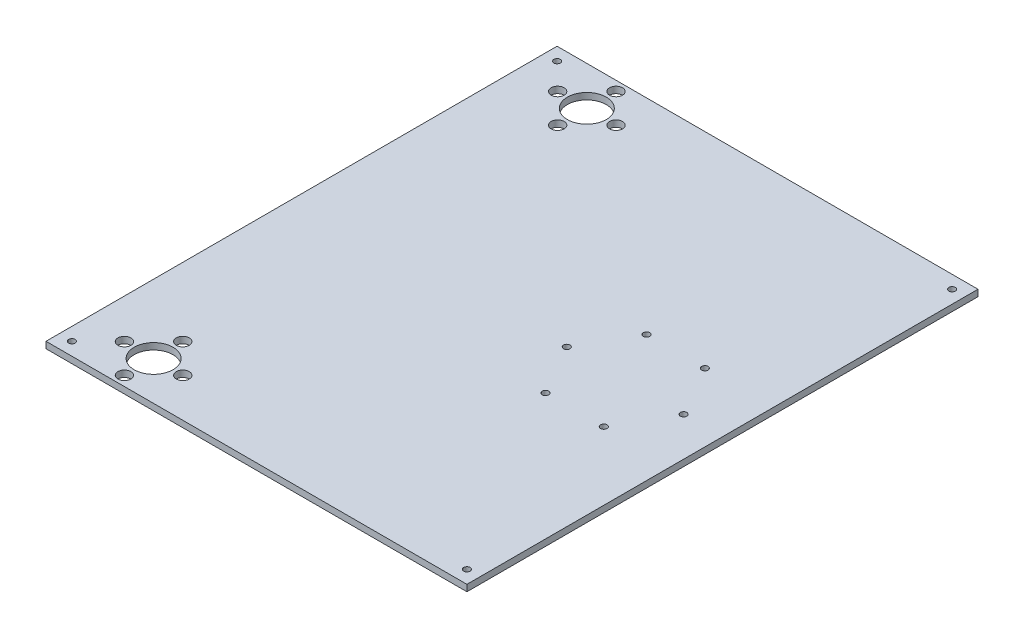
ISO-10303-21;
HEADER;
FILE_DESCRIPTION(('STEP AP214'),'2;1');
FILE_NAME('part.step','',(''),(''),'','','');
FILE_SCHEMA(('AUTOMOTIVE_DESIGN { 1 0 10303 214 1 1 1 1 }'));
ENDSEC;
DATA;
#1=APPLICATION_CONTEXT('core data for automotive mechanical design processes');
#2=APPLICATION_PROTOCOL_DEFINITION('international standard','automotive_design',2000,#1);
#3=PRODUCT_CONTEXT('',#1,'mechanical');
#4=PRODUCT('Part','Part','',(#3));
#5=PRODUCT_RELATED_PRODUCT_CATEGORY('part','',(#4));
#6=PRODUCT_DEFINITION_FORMATION('','',#4);
#7=PRODUCT_DEFINITION_CONTEXT('part definition',#1,'design');
#8=PRODUCT_DEFINITION('design','',#6,#7);
#9=PRODUCT_DEFINITION_SHAPE('','',#8);
#10=(LENGTH_UNIT() NAMED_UNIT(*) SI_UNIT(.MILLI.,.METRE.));
#11=(NAMED_UNIT(*) PLANE_ANGLE_UNIT() SI_UNIT($,.RADIAN.));
#12=(NAMED_UNIT(*) SI_UNIT($,.STERADIAN.) SOLID_ANGLE_UNIT());
#13=UNCERTAINTY_MEASURE_WITH_UNIT(LENGTH_MEASURE(1.E-05),#10,'distance_accuracy_value','');
#14=(GEOMETRIC_REPRESENTATION_CONTEXT(3) GLOBAL_UNCERTAINTY_ASSIGNED_CONTEXT((#13)) GLOBAL_UNIT_ASSIGNED_CONTEXT((#10,
#11,#12)) REPRESENTATION_CONTEXT('',''));
#15=CARTESIAN_POINT('',(0.,0.,0.));
#16=DIRECTION('',(0.,0.,1.));
#17=DIRECTION('',(1.,0.,0.));
#18=AXIS2_PLACEMENT_3D('',#15,#16,#17);
#19=CARTESIAN_POINT('',(162.25,5.,-197.));
#20=DIRECTION('',(-1.,0.,0.));
#21=DIRECTION('',(0.,0.,1.));
#22=AXIS2_PLACEMENT_3D('',#19,#20,#21);
#23=PLANE('',#22);
#24=DIRECTION('',(0.,0.,-1.));
#25=VECTOR('',#24,1.);
#26=CARTESIAN_POINT('',(162.25,0.,-197.));
#27=LINE('',#26,#25);
#28=CARTESIAN_POINT('',(162.25,0.,197.));
#29=VERTEX_POINT('',#28);
#30=CARTESIAN_POINT('',(162.25,0.,-197.));
#31=VERTEX_POINT('',#30);
#32=EDGE_CURVE('E97',#29,#31,#27,.T.);
#33=ORIENTED_EDGE('',*,*,#32,.T.);
#34=DIRECTION('',(0.,-1.,0.));
#35=VECTOR('',#34,1.);
#36=CARTESIAN_POINT('',(162.25,5.,-197.));
#37=LINE('',#36,#35);
#38=CARTESIAN_POINT('',(162.25,5.,-197.));
#39=VERTEX_POINT('',#38);
#40=EDGE_CURVE('E11',#39,#31,#37,.T.);
#41=ORIENTED_EDGE('',*,*,#40,.F.);
#42=DIRECTION('',(0.,0.,-1.));
#43=VECTOR('',#42,1.);
#44=CARTESIAN_POINT('',(162.25,5.,-197.));
#45=LINE('',#44,#43);
#46=CARTESIAN_POINT('',(162.25,5.,197.));
#47=VERTEX_POINT('',#46);
#48=EDGE_CURVE('E85',#47,#39,#45,.T.);
#49=ORIENTED_EDGE('',*,*,#48,.F.);
#50=DIRECTION('',(0.,-1.,0.));
#51=VECTOR('',#50,1.);
#52=CARTESIAN_POINT('',(162.25,5.,197.));
#53=LINE('',#52,#51);
#54=EDGE_CURVE('E93',#47,#29,#53,.T.);
#55=ORIENTED_EDGE('',*,*,#54,.T.);
#56=EDGE_LOOP('',(#33,#41,#49,#55));
#57=FACE_BOUND('',#56,.T.);
#58=ADVANCED_FACE('F34',(#57),#23,.F.);
#59=CARTESIAN_POINT('',(-162.25,5.,-197.));
#60=DIRECTION('',(0.,0.,1.));
#61=DIRECTION('',(1.,0.,0.));
#62=AXIS2_PLACEMENT_3D('',#59,#60,#61);
#63=PLANE('',#62);
#64=DIRECTION('',(-1.,0.,0.));
#65=VECTOR('',#64,1.);
#66=CARTESIAN_POINT('',(-162.25,0.,-197.));
#67=LINE('',#66,#65);
#68=CARTESIAN_POINT('',(-162.25,0.,-197.));
#69=VERTEX_POINT('',#68);
#70=EDGE_CURVE('E89',#31,#69,#67,.T.);
#71=ORIENTED_EDGE('',*,*,#70,.T.);
#72=DIRECTION('',(0.,-1.,0.));
#73=VECTOR('',#72,1.);
#74=CARTESIAN_POINT('',(-162.25,5.,-197.));
#75=LINE('',#74,#73);
#76=CARTESIAN_POINT('',(-162.25,5.,-197.));
#77=VERTEX_POINT('',#76);
#78=EDGE_CURVE('E42',#77,#69,#75,.T.);
#79=ORIENTED_EDGE('',*,*,#78,.F.);
#80=DIRECTION('',(-1.,0.,0.));
#81=VECTOR('',#80,1.);
#82=CARTESIAN_POINT('',(-162.25,5.,-197.));
#83=LINE('',#82,#81);
#84=EDGE_CURVE('E80',#39,#77,#83,.T.);
#85=ORIENTED_EDGE('',*,*,#84,.F.);
#86=ORIENTED_EDGE('',*,*,#40,.T.);
#87=EDGE_LOOP('',(#71,#79,#85,#86));
#88=FACE_BOUND('',#87,.T.);
#89=ADVANCED_FACE('F88',(#88),#63,.F.);
#90=CARTESIAN_POINT('',(-162.25,5.,-197.));
#91=DIRECTION('',(1.,0.,0.));
#92=DIRECTION('',(0.,0.,-1.));
#93=AXIS2_PLACEMENT_3D('',#90,#91,#92);
#94=PLANE('',#93);
#95=DIRECTION('',(0.,0.,1.));
#96=VECTOR('',#95,1.);
#97=CARTESIAN_POINT('',(-162.25,0.,-197.));
#98=LINE('',#97,#96);
#99=CARTESIAN_POINT('',(-162.25,0.,197.));
#100=VERTEX_POINT('',#99);
#101=EDGE_CURVE('E67',#69,#100,#98,.T.);
#102=ORIENTED_EDGE('',*,*,#101,.T.);
#103=DIRECTION('',(0.,-1.,0.));
#104=VECTOR('',#103,1.);
#105=CARTESIAN_POINT('',(-162.25,5.,197.));
#106=LINE('',#105,#104);
#107=CARTESIAN_POINT('',(-162.25,5.,197.));
#108=VERTEX_POINT('',#107);
#109=EDGE_CURVE('E90',#108,#100,#106,.T.);
#110=ORIENTED_EDGE('',*,*,#109,.F.);
#111=DIRECTION('',(0.,0.,1.));
#112=VECTOR('',#111,1.);
#113=CARTESIAN_POINT('',(-162.25,5.,-197.));
#114=LINE('',#113,#112);
#115=EDGE_CURVE('E83',#77,#108,#114,.T.);
#116=ORIENTED_EDGE('',*,*,#115,.F.);
#117=ORIENTED_EDGE('',*,*,#78,.T.);
#118=EDGE_LOOP('',(#102,#110,#116,#117));
#119=FACE_BOUND('',#118,.T.);
#120=ADVANCED_FACE('F91',(#119),#94,.F.);
#121=CARTESIAN_POINT('',(-162.25,5.,197.));
#122=DIRECTION('',(0.,0.,-1.));
#123=DIRECTION('',(-1.,0.,0.));
#124=AXIS2_PLACEMENT_3D('',#121,#122,#123);
#125=PLANE('',#124);
#126=DIRECTION('',(1.,0.,0.));
#127=VECTOR('',#126,1.);
#128=CARTESIAN_POINT('',(-162.25,0.,197.));
#129=LINE('',#128,#127);
#130=EDGE_CURVE('E73',#100,#29,#129,.T.);
#131=ORIENTED_EDGE('',*,*,#130,.T.);
#132=ORIENTED_EDGE('',*,*,#54,.F.);
#133=DIRECTION('',(1.,0.,0.));
#134=VECTOR('',#133,1.);
#135=CARTESIAN_POINT('',(-162.25,5.,197.));
#136=LINE('',#135,#134);
#137=EDGE_CURVE('E50',#108,#47,#136,.T.);
#138=ORIENTED_EDGE('',*,*,#137,.F.);
#139=ORIENTED_EDGE('',*,*,#109,.T.);
#140=EDGE_LOOP('',(#131,#132,#138,#139));
#141=FACE_BOUND('',#140,.T.);
#142=ADVANCED_FACE('F105',(#141),#125,.F.);
#143=CARTESIAN_POINT('',(0.,5.,0.));
#144=DIRECTION('',(0.,1.,0.));
#145=DIRECTION('',(0.,0.,1.));
#146=AXIS2_PLACEMENT_3D('',#143,#144,#145);
#147=PLANE('',#146);
#148=CARTESIAN_POINT('',(-109.309999999999,5.,-144.5));
#149=DIRECTION('',(0.,1.,0.));
#150=DIRECTION('',(0.,0.,1.));
#151=AXIS2_PLACEMENT_3D('',#148,#149,#150);
#152=CIRCLE('',#151,5.);
#153=CARTESIAN_POINT('',(-109.309999999999,5.,-139.5));
#154=VERTEX_POINT('',#153);
#155=EDGE_CURVE('E201',#154,#154,#152,.T.);
#156=ORIENTED_EDGE('',*,*,#155,.F.);
#157=EDGE_LOOP('',(#156));
#158=FACE_BOUND('',#157,.T.);
#159=CARTESIAN_POINT('',(-86.8099999999997,5.,-167.));
#160=DIRECTION('',(0.,1.,0.));
#161=DIRECTION('',(0.,0.,1.));
#162=AXIS2_PLACEMENT_3D('',#159,#160,#161);
#163=CIRCLE('',#162,4.99999999999998);
#164=CARTESIAN_POINT('',(-86.8099999999997,5.,-162.));
#165=VERTEX_POINT('',#164);
#166=EDGE_CURVE('E208',#165,#165,#163,.T.);
#167=ORIENTED_EDGE('',*,*,#166,.F.);
#168=EDGE_LOOP('',(#167));
#169=FACE_BOUND('',#168,.T.);
#170=CARTESIAN_POINT('',(-86.81,5.,167.));
#171=DIRECTION('',(0.,1.,0.));
#172=DIRECTION('',(0.,0.,1.));
#173=AXIS2_PLACEMENT_3D('',#170,#171,#172);
#174=CIRCLE('',#173,5.);
#175=CARTESIAN_POINT('',(-86.81,5.,172.));
#176=VERTEX_POINT('',#175);
#177=EDGE_CURVE('E214',#176,#176,#174,.T.);
#178=ORIENTED_EDGE('',*,*,#177,.F.);
#179=EDGE_LOOP('',(#178));
#180=FACE_BOUND('',#179,.T.);
#181=CARTESIAN_POINT('',(-109.31,5.,144.5));
#182=DIRECTION('',(0.,1.,0.));
#183=DIRECTION('',(0.,0.,1.));
#184=AXIS2_PLACEMENT_3D('',#181,#182,#183);
#185=CIRCLE('',#184,4.99999999999999);
#186=CARTESIAN_POINT('',(-109.31,5.,149.5));
#187=VERTEX_POINT('',#186);
#188=EDGE_CURVE('E220',#187,#187,#185,.T.);
#189=ORIENTED_EDGE('',*,*,#188,.F.);
#190=EDGE_LOOP('',(#189));
#191=FACE_BOUND('',#190,.T.);
#192=CARTESIAN_POINT('',(-109.31,5.,167.));
#193=DIRECTION('',(0.,1.,0.));
#194=DIRECTION('',(0.,0.,1.));
#195=AXIS2_PLACEMENT_3D('',#192,#193,#194);
#196=CIRCLE('',#195,15.);
#197=CARTESIAN_POINT('',(-109.31,5.,182.));
#198=VERTEX_POINT('',#197);
#199=EDGE_CURVE('E184',#198,#198,#196,.T.);
#200=ORIENTED_EDGE('',*,*,#199,.F.);
#201=EDGE_LOOP('',(#200));
#202=FACE_BOUND('',#201,.T.);
#203=CARTESIAN_POINT('',(-109.31,5.,-189.5));
#204=DIRECTION('',(0.,1.,0.));
#205=DIRECTION('',(0.,0.,1.));
#206=AXIS2_PLACEMENT_3D('',#203,#204,#205);
#207=CIRCLE('',#206,5.00000000000001);
#208=CARTESIAN_POINT('',(-109.31,5.,-184.5));
#209=VERTEX_POINT('',#208);
#210=EDGE_CURVE('E177',#209,#209,#207,.T.);
#211=ORIENTED_EDGE('',*,*,#210,.F.);
#212=EDGE_LOOP('',(#211));
#213=FACE_BOUND('',#212,.T.);
#214=CARTESIAN_POINT('',(-109.31,5.,189.5));
#215=DIRECTION('',(0.,1.,0.));
#216=DIRECTION('',(0.,0.,1.));
#217=AXIS2_PLACEMENT_3D('',#214,#215,#216);
#218=CIRCLE('',#217,5.00000000000001);
#219=CARTESIAN_POINT('',(-109.31,5.,194.5));
#220=VERTEX_POINT('',#219);
#221=EDGE_CURVE('E196',#220,#220,#218,.T.);
#222=ORIENTED_EDGE('',*,*,#221,.F.);
#223=EDGE_LOOP('',(#222));
#224=FACE_BOUND('',#223,.T.);
#225=CARTESIAN_POINT('',(-131.81,5.,167.));
#226=DIRECTION('',(0.,1.,0.));
#227=DIRECTION('',(0.,0.,1.));
#228=AXIS2_PLACEMENT_3D('',#225,#226,#227);
#229=CIRCLE('',#228,5.00000000000001);
#230=CARTESIAN_POINT('',(-131.81,5.,172.));
#231=VERTEX_POINT('',#230);
#232=EDGE_CURVE('E189',#231,#231,#229,.T.);
#233=ORIENTED_EDGE('',*,*,#232,.F.);
#234=EDGE_LOOP('',(#233));
#235=FACE_BOUND('',#234,.T.);
#236=CARTESIAN_POINT('',(-131.81,5.,-167.));
#237=DIRECTION('',(0.,1.,0.));
#238=DIRECTION('',(0.,0.,1.));
#239=AXIS2_PLACEMENT_3D('',#236,#237,#238);
#240=CIRCLE('',#239,5.00000000000003);
#241=CARTESIAN_POINT('',(-131.81,5.,-162.));
#242=VERTEX_POINT('',#241);
#243=EDGE_CURVE('E225',#242,#242,#240,.T.);
#244=ORIENTED_EDGE('',*,*,#243,.F.);
#245=EDGE_LOOP('',(#244));
#246=FACE_BOUND('',#245,.T.);
#247=CARTESIAN_POINT('',(-109.31,5.,-167.));
#248=DIRECTION('',(0.,1.,0.));
#249=DIRECTION('',(0.,0.,1.));
#250=AXIS2_PLACEMENT_3D('',#247,#248,#249);
#251=CIRCLE('',#250,15.);
#252=CARTESIAN_POINT('',(-109.31,5.,-152.));
#253=VERTEX_POINT('',#252);
#254=EDGE_CURVE('E171',#253,#253,#251,.T.);
#255=ORIENTED_EDGE('',*,*,#254,.F.);
#256=EDGE_LOOP('',(#255));
#257=FACE_BOUND('',#256,.T.);
#258=CARTESIAN_POINT('',(132.25,5.,0.));
#259=DIRECTION('',(0.,1.,0.));
#260=DIRECTION('',(0.,0.,1.));
#261=AXIS2_PLACEMENT_3D('',#258,#259,#260);
#262=CIRCLE('',#261,2.5);
#263=CARTESIAN_POINT('',(132.25,5.,2.5));
#264=VERTEX_POINT('',#263);
#265=EDGE_CURVE('E160',#264,#264,#262,.T.);
#266=ORIENTED_EDGE('',*,*,#265,.F.);
#267=EDGE_LOOP('',(#266));
#268=FACE_BOUND('',#267,.T.);
#269=CARTESIAN_POINT('',(109.749999999999,5.,-38.9711431702988));
#270=DIRECTION('',(0.,1.,0.));
#271=DIRECTION('',(0.,0.,1.));
#272=AXIS2_PLACEMENT_3D('',#269,#270,#271);
#273=CIRCLE('',#272,2.49999999999999);
#274=CARTESIAN_POINT('',(109.749999999999,5.,-36.4711431702989));
#275=VERTEX_POINT('',#274);
#276=EDGE_CURVE('E161',#275,#275,#273,.T.);
#277=ORIENTED_EDGE('',*,*,#276,.F.);
#278=EDGE_LOOP('',(#277));
#279=FACE_BOUND('',#278,.T.);
#280=CARTESIAN_POINT('',(64.7499999999994,5.,-38.971143170298));
#281=DIRECTION('',(0.,1.,0.));
#282=DIRECTION('',(0.,0.,1.));
#283=AXIS2_PLACEMENT_3D('',#280,#281,#282);
#284=CIRCLE('',#283,2.49999999999999);
#285=CARTESIAN_POINT('',(64.7499999999994,5.,-36.471143170298));
#286=VERTEX_POINT('',#285);
#287=EDGE_CURVE('E135',#286,#286,#284,.T.);
#288=ORIENTED_EDGE('',*,*,#287,.F.);
#289=EDGE_LOOP('',(#288));
#290=FACE_BOUND('',#289,.T.);
#291=CARTESIAN_POINT('',(42.2500000000001,5.,2.19273067816165E-12));
#292=DIRECTION('',(0.,1.,0.));
#293=DIRECTION('',(0.,0.,1.));
#294=AXIS2_PLACEMENT_3D('',#291,#292,#293);
#295=CIRCLE('',#294,2.49999999999999);
#296=CARTESIAN_POINT('',(42.2500000000001,5.,2.50000000000218));
#297=VERTEX_POINT('',#296);
#298=EDGE_CURVE('E142',#297,#297,#295,.T.);
#299=ORIENTED_EDGE('',*,*,#298,.F.);
#300=EDGE_LOOP('',(#299));
#301=FACE_BOUND('',#300,.T.);
#302=CARTESIAN_POINT('',(64.7500000000009,5.,38.9711431703015));
#303=DIRECTION('',(0.,1.,0.));
#304=DIRECTION('',(0.,0.,1.));
#305=AXIS2_PLACEMENT_3D('',#302,#303,#304);
#306=CIRCLE('',#305,2.49999999999999);
#307=CARTESIAN_POINT('',(64.7500000000009,5.,41.4711431703015));
#308=VERTEX_POINT('',#307);
#309=EDGE_CURVE('E148',#308,#308,#306,.T.);
#310=ORIENTED_EDGE('',*,*,#309,.F.);
#311=EDGE_LOOP('',(#310));
#312=FACE_BOUND('',#311,.T.);
#313=CARTESIAN_POINT('',(109.750000000001,5.,38.9711431703004));
#314=DIRECTION('',(0.,1.,0.));
#315=DIRECTION('',(0.,0.,1.));
#316=AXIS2_PLACEMENT_3D('',#313,#314,#315);
#317=CIRCLE('',#316,2.5);
#318=CARTESIAN_POINT('',(109.750000000001,5.,41.4711431703004));
#319=VERTEX_POINT('',#318);
#320=EDGE_CURVE('E154',#319,#319,#317,.T.);
#321=ORIENTED_EDGE('',*,*,#320,.F.);
#322=EDGE_LOOP('',(#321));
#323=FACE_BOUND('',#322,.T.);
#324=CARTESIAN_POINT('',(152.25,5.,187.));
#325=DIRECTION('',(0.,1.,0.));
#326=DIRECTION('',(0.,0.,1.));
#327=AXIS2_PLACEMENT_3D('',#324,#325,#326);
#328=CIRCLE('',#327,2.5);
#329=CARTESIAN_POINT('',(152.25,5.,189.5));
#330=VERTEX_POINT('',#329);
#331=EDGE_CURVE('E117',#330,#330,#328,.T.);
#332=ORIENTED_EDGE('',*,*,#331,.F.);
#333=EDGE_LOOP('',(#332));
#334=FACE_BOUND('',#333,.T.);
#335=CARTESIAN_POINT('',(-152.25,5.,187.));
#336=DIRECTION('',(0.,1.,0.));
#337=DIRECTION('',(0.,0.,1.));
#338=AXIS2_PLACEMENT_3D('',#335,#336,#337);
#339=CIRCLE('',#338,2.5);
#340=CARTESIAN_POINT('',(-152.25,5.,189.5));
#341=VERTEX_POINT('',#340);
#342=EDGE_CURVE('E124',#341,#341,#339,.T.);
#343=ORIENTED_EDGE('',*,*,#342,.F.);
#344=EDGE_LOOP('',(#343));
#345=FACE_BOUND('',#344,.T.);
#346=CARTESIAN_POINT('',(-152.25,5.,-187.));
#347=DIRECTION('',(0.,1.,0.));
#348=DIRECTION('',(0.,0.,1.));
#349=AXIS2_PLACEMENT_3D('',#346,#347,#348);
#350=CIRCLE('',#349,2.5);
#351=CARTESIAN_POINT('',(-152.25,5.,-184.5));
#352=VERTEX_POINT('',#351);
#353=EDGE_CURVE('E130',#352,#352,#350,.T.);
#354=ORIENTED_EDGE('',*,*,#353,.F.);
#355=EDGE_LOOP('',(#354));
#356=FACE_BOUND('',#355,.T.);
#357=CARTESIAN_POINT('',(152.25,5.,-187.));
#358=DIRECTION('',(0.,1.,0.));
#359=DIRECTION('',(0.,0.,1.));
#360=AXIS2_PLACEMENT_3D('',#357,#358,#359);
#361=CIRCLE('',#360,2.5);
#362=CARTESIAN_POINT('',(152.25,5.,-184.5));
#363=VERTEX_POINT('',#362);
#364=EDGE_CURVE('E111',#363,#363,#361,.T.);
#365=ORIENTED_EDGE('',*,*,#364,.F.);
#366=EDGE_LOOP('',(#365));
#367=FACE_BOUND('',#366,.T.);
#368=ORIENTED_EDGE('',*,*,#48,.T.);
#369=ORIENTED_EDGE('',*,*,#84,.T.);
#370=ORIENTED_EDGE('',*,*,#115,.T.);
#371=ORIENTED_EDGE('',*,*,#137,.T.);
#372=EDGE_LOOP('',(#368,#369,#370,#371));
#373=FACE_BOUND('',#372,.T.);
#374=ADVANCED_FACE('F81',(#158,#169,#180,#191,#202,#213,#224,#235,#246,#257,#268,#279,#290,#301,
#312,#323,#334,#345,#356,#367,#373),#147,.T.);
#375=CARTESIAN_POINT('',(0.,0.,0.));
#376=DIRECTION('',(0.,1.,0.));
#377=DIRECTION('',(0.,0.,1.));
#378=AXIS2_PLACEMENT_3D('',#375,#376,#377);
#379=PLANE('',#378);
#380=CARTESIAN_POINT('',(-109.309999999999,0.,-144.5));
#381=DIRECTION('',(0.,1.,0.));
#382=DIRECTION('',(0.,0.,1.));
#383=AXIS2_PLACEMENT_3D('',#380,#381,#382);
#384=CIRCLE('',#383,5.);
#385=CARTESIAN_POINT('',(-109.309999999999,0.,-139.5));
#386=VERTEX_POINT('',#385);
#387=EDGE_CURVE('E204',#386,#386,#384,.T.);
#388=ORIENTED_EDGE('',*,*,#387,.T.);
#389=EDGE_LOOP('',(#388));
#390=FACE_BOUND('',#389,.T.);
#391=CARTESIAN_POINT('',(-86.8099999999997,0.,-167.));
#392=DIRECTION('',(0.,1.,0.));
#393=DIRECTION('',(0.,0.,1.));
#394=AXIS2_PLACEMENT_3D('',#391,#392,#393);
#395=CIRCLE('',#394,4.99999999999998);
#396=CARTESIAN_POINT('',(-86.8099999999997,0.,-162.));
#397=VERTEX_POINT('',#396);
#398=EDGE_CURVE('E211',#397,#397,#395,.T.);
#399=ORIENTED_EDGE('',*,*,#398,.T.);
#400=EDGE_LOOP('',(#399));
#401=FACE_BOUND('',#400,.T.);
#402=CARTESIAN_POINT('',(-86.81,0.,167.));
#403=DIRECTION('',(0.,1.,0.));
#404=DIRECTION('',(0.,0.,1.));
#405=AXIS2_PLACEMENT_3D('',#402,#403,#404);
#406=CIRCLE('',#405,5.);
#407=CARTESIAN_POINT('',(-86.81,0.,172.));
#408=VERTEX_POINT('',#407);
#409=EDGE_CURVE('E217',#408,#408,#406,.T.);
#410=ORIENTED_EDGE('',*,*,#409,.T.);
#411=EDGE_LOOP('',(#410));
#412=FACE_BOUND('',#411,.T.);
#413=CARTESIAN_POINT('',(-109.31,0.,144.5));
#414=DIRECTION('',(0.,1.,0.));
#415=DIRECTION('',(0.,0.,1.));
#416=AXIS2_PLACEMENT_3D('',#413,#414,#415);
#417=CIRCLE('',#416,4.99999999999999);
#418=CARTESIAN_POINT('',(-109.31,0.,149.5));
#419=VERTEX_POINT('',#418);
#420=EDGE_CURVE('E193',#419,#419,#417,.T.);
#421=ORIENTED_EDGE('',*,*,#420,.T.);
#422=EDGE_LOOP('',(#421));
#423=FACE_BOUND('',#422,.T.);
#424=CARTESIAN_POINT('',(-109.31,0.,167.));
#425=DIRECTION('',(0.,1.,0.));
#426=DIRECTION('',(0.,0.,1.));
#427=AXIS2_PLACEMENT_3D('',#424,#425,#426);
#428=CIRCLE('',#427,15.);
#429=CARTESIAN_POINT('',(-109.31,0.,182.));
#430=VERTEX_POINT('',#429);
#431=EDGE_CURVE('E174',#430,#430,#428,.T.);
#432=ORIENTED_EDGE('',*,*,#431,.T.);
#433=EDGE_LOOP('',(#432));
#434=FACE_BOUND('',#433,.T.);
#435=CARTESIAN_POINT('',(-109.31,0.,-189.5));
#436=DIRECTION('',(0.,1.,0.));
#437=DIRECTION('',(0.,0.,1.));
#438=AXIS2_PLACEMENT_3D('',#435,#436,#437);
#439=CIRCLE('',#438,5.00000000000001);
#440=CARTESIAN_POINT('',(-109.31,0.,-184.5));
#441=VERTEX_POINT('',#440);
#442=EDGE_CURVE('E180',#441,#441,#439,.T.);
#443=ORIENTED_EDGE('',*,*,#442,.T.);
#444=EDGE_LOOP('',(#443));
#445=FACE_BOUND('',#444,.T.);
#446=CARTESIAN_POINT('',(-109.31,0.,189.5));
#447=DIRECTION('',(0.,1.,0.));
#448=DIRECTION('',(0.,0.,1.));
#449=AXIS2_PLACEMENT_3D('',#446,#447,#448);
#450=CIRCLE('',#449,5.00000000000001);
#451=CARTESIAN_POINT('',(-109.31,0.,194.5));
#452=VERTEX_POINT('',#451);
#453=EDGE_CURVE('E181',#452,#452,#450,.T.);
#454=ORIENTED_EDGE('',*,*,#453,.T.);
#455=EDGE_LOOP('',(#454));
#456=FACE_BOUND('',#455,.T.);
#457=CARTESIAN_POINT('',(-131.81,0.,167.));
#458=DIRECTION('',(0.,1.,0.));
#459=DIRECTION('',(0.,0.,1.));
#460=AXIS2_PLACEMENT_3D('',#457,#458,#459);
#461=CIRCLE('',#460,5.00000000000001);
#462=CARTESIAN_POINT('',(-131.81,0.,172.));
#463=VERTEX_POINT('',#462);
#464=EDGE_CURVE('E192',#463,#463,#461,.T.);
#465=ORIENTED_EDGE('',*,*,#464,.T.);
#466=EDGE_LOOP('',(#465));
#467=FACE_BOUND('',#466,.T.);
#468=CARTESIAN_POINT('',(-131.81,0.,-167.));
#469=DIRECTION('',(0.,1.,0.));
#470=DIRECTION('',(0.,0.,1.));
#471=AXIS2_PLACEMENT_3D('',#468,#469,#470);
#472=CIRCLE('',#471,5.00000000000003);
#473=CARTESIAN_POINT('',(-131.81,0.,-162.));
#474=VERTEX_POINT('',#473);
#475=EDGE_CURVE('E205',#474,#474,#472,.T.);
#476=ORIENTED_EDGE('',*,*,#475,.T.);
#477=EDGE_LOOP('',(#476));
#478=FACE_BOUND('',#477,.T.);
#479=CARTESIAN_POINT('',(-109.31,0.,-167.));
#480=DIRECTION('',(0.,1.,0.));
#481=DIRECTION('',(0.,0.,1.));
#482=AXIS2_PLACEMENT_3D('',#479,#480,#481);
#483=CIRCLE('',#482,15.);
#484=CARTESIAN_POINT('',(-109.31,0.,-152.));
#485=VERTEX_POINT('',#484);
#486=EDGE_CURVE('E164',#485,#485,#483,.T.);
#487=ORIENTED_EDGE('',*,*,#486,.T.);
#488=EDGE_LOOP('',(#487));
#489=FACE_BOUND('',#488,.T.);
#490=CARTESIAN_POINT('',(132.25,0.,0.));
#491=DIRECTION('',(0.,1.,0.));
#492=DIRECTION('',(0.,0.,1.));
#493=AXIS2_PLACEMENT_3D('',#490,#491,#492);
#494=CIRCLE('',#493,2.5);
#495=CARTESIAN_POINT('',(132.25,0.,2.5));
#496=VERTEX_POINT('',#495);
#497=EDGE_CURVE('E121',#496,#496,#494,.T.);
#498=ORIENTED_EDGE('',*,*,#497,.T.);
#499=EDGE_LOOP('',(#498));
#500=FACE_BOUND('',#499,.T.);
#501=CARTESIAN_POINT('',(109.749999999999,0.,-38.9711431702988));
#502=DIRECTION('',(0.,1.,0.));
#503=DIRECTION('',(0.,0.,1.));
#504=AXIS2_PLACEMENT_3D('',#501,#502,#503);
#505=CIRCLE('',#504,2.49999999999999);
#506=CARTESIAN_POINT('',(109.749999999999,0.,-36.4711431702989));
#507=VERTEX_POINT('',#506);
#508=EDGE_CURVE('E139',#507,#507,#505,.T.);
#509=ORIENTED_EDGE('',*,*,#508,.T.);
#510=EDGE_LOOP('',(#509));
#511=FACE_BOUND('',#510,.T.);
#512=CARTESIAN_POINT('',(64.7499999999994,0.,-38.971143170298));
#513=DIRECTION('',(0.,1.,0.));
#514=DIRECTION('',(0.,0.,1.));
#515=AXIS2_PLACEMENT_3D('',#512,#513,#514);
#516=CIRCLE('',#515,2.49999999999999);
#517=CARTESIAN_POINT('',(64.7499999999994,0.,-36.471143170298));
#518=VERTEX_POINT('',#517);
#519=EDGE_CURVE('E138',#518,#518,#516,.T.);
#520=ORIENTED_EDGE('',*,*,#519,.T.);
#521=EDGE_LOOP('',(#520));
#522=FACE_BOUND('',#521,.T.);
#523=CARTESIAN_POINT('',(42.2500000000001,0.,2.19273067816165E-12));
#524=DIRECTION('',(0.,1.,0.));
#525=DIRECTION('',(0.,0.,1.));
#526=AXIS2_PLACEMENT_3D('',#523,#524,#525);
#527=CIRCLE('',#526,2.49999999999999);
#528=CARTESIAN_POINT('',(42.2500000000001,0.,2.50000000000218));
#529=VERTEX_POINT('',#528);
#530=EDGE_CURVE('E145',#529,#529,#527,.T.);
#531=ORIENTED_EDGE('',*,*,#530,.T.);
#532=EDGE_LOOP('',(#531));
#533=FACE_BOUND('',#532,.T.);
#534=CARTESIAN_POINT('',(64.7500000000009,0.,38.9711431703015));
#535=DIRECTION('',(0.,1.,0.));
#536=DIRECTION('',(0.,0.,1.));
#537=AXIS2_PLACEMENT_3D('',#534,#535,#536);
#538=CIRCLE('',#537,2.49999999999999);
#539=CARTESIAN_POINT('',(64.7500000000009,0.,41.4711431703015));
#540=VERTEX_POINT('',#539);
#541=EDGE_CURVE('E151',#540,#540,#538,.T.);
#542=ORIENTED_EDGE('',*,*,#541,.T.);
#543=EDGE_LOOP('',(#542));
#544=FACE_BOUND('',#543,.T.);
#545=CARTESIAN_POINT('',(109.750000000001,0.,38.9711431703004));
#546=DIRECTION('',(0.,1.,0.));
#547=DIRECTION('',(0.,0.,1.));
#548=AXIS2_PLACEMENT_3D('',#545,#546,#547);
#549=CIRCLE('',#548,2.5);
#550=CARTESIAN_POINT('',(109.750000000001,0.,41.4711431703004));
#551=VERTEX_POINT('',#550);
#552=EDGE_CURVE('E157',#551,#551,#549,.T.);
#553=ORIENTED_EDGE('',*,*,#552,.T.);
#554=EDGE_LOOP('',(#553));
#555=FACE_BOUND('',#554,.T.);
#556=CARTESIAN_POINT('',(152.25,0.,187.));
#557=DIRECTION('',(0.,1.,0.));
#558=DIRECTION('',(0.,0.,1.));
#559=AXIS2_PLACEMENT_3D('',#556,#557,#558);
#560=CIRCLE('',#559,2.5);
#561=CARTESIAN_POINT('',(152.25,0.,189.5));
#562=VERTEX_POINT('',#561);
#563=EDGE_CURVE('E120',#562,#562,#560,.T.);
#564=ORIENTED_EDGE('',*,*,#563,.T.);
#565=EDGE_LOOP('',(#564));
#566=FACE_BOUND('',#565,.T.);
#567=CARTESIAN_POINT('',(-152.25,0.,187.));
#568=DIRECTION('',(0.,1.,0.));
#569=DIRECTION('',(0.,0.,1.));
#570=AXIS2_PLACEMENT_3D('',#567,#568,#569);
#571=CIRCLE('',#570,2.5);
#572=CARTESIAN_POINT('',(-152.25,0.,189.5));
#573=VERTEX_POINT('',#572);
#574=EDGE_CURVE('E127',#573,#573,#571,.T.);
#575=ORIENTED_EDGE('',*,*,#574,.T.);
#576=EDGE_LOOP('',(#575));
#577=FACE_BOUND('',#576,.T.);
#578=CARTESIAN_POINT('',(-152.25,0.,-187.));
#579=DIRECTION('',(0.,1.,0.));
#580=DIRECTION('',(0.,0.,1.));
#581=AXIS2_PLACEMENT_3D('',#578,#579,#580);
#582=CIRCLE('',#581,2.5);
#583=CARTESIAN_POINT('',(-152.25,0.,-184.5));
#584=VERTEX_POINT('',#583);
#585=EDGE_CURVE('E114',#584,#584,#582,.T.);
#586=ORIENTED_EDGE('',*,*,#585,.T.);
#587=EDGE_LOOP('',(#586));
#588=FACE_BOUND('',#587,.T.);
#589=CARTESIAN_POINT('',(152.25,0.,-187.));
#590=DIRECTION('',(0.,1.,0.));
#591=DIRECTION('',(0.,0.,1.));
#592=AXIS2_PLACEMENT_3D('',#589,#590,#591);
#593=CIRCLE('',#592,2.5);
#594=CARTESIAN_POINT('',(152.25,0.,-184.5));
#595=VERTEX_POINT('',#594);
#596=EDGE_CURVE('E100',#595,#595,#593,.T.);
#597=ORIENTED_EDGE('',*,*,#596,.T.);
#598=EDGE_LOOP('',(#597));
#599=FACE_BOUND('',#598,.T.);
#600=ORIENTED_EDGE('',*,*,#32,.F.);
#601=ORIENTED_EDGE('',*,*,#130,.F.);
#602=ORIENTED_EDGE('',*,*,#101,.F.);
#603=ORIENTED_EDGE('',*,*,#70,.F.);
#604=EDGE_LOOP('',(#600,#601,#602,#603));
#605=FACE_BOUND('',#604,.T.);
#606=ADVANCED_FACE('F108',(#390,#401,#412,#423,#434,#445,#456,#467,#478,#489,#500,#511,#522,
#533,#544,#555,#566,#577,#588,#599,#605),#379,.F.);
#607=CARTESIAN_POINT('',(152.25,0.,-187.));
#608=DIRECTION('',(0.,1.,0.));
#609=DIRECTION('',(0.,0.,1.));
#610=AXIS2_PLACEMENT_3D('',#607,#608,#609);
#611=CYLINDRICAL_SURFACE('',#610,2.5);
#612=ORIENTED_EDGE('',*,*,#596,.F.);
#613=EDGE_LOOP('',(#612));
#614=FACE_BOUND('',#613,.T.);
#615=ORIENTED_EDGE('',*,*,#364,.T.);
#616=EDGE_LOOP('',(#615));
#617=FACE_BOUND('',#616,.T.);
#618=ADVANCED_FACE('F267',(#614,#617),#611,.F.);
#619=CARTESIAN_POINT('',(-152.25,0.,-187.));
#620=DIRECTION('',(0.,1.,0.));
#621=DIRECTION('',(0.,0.,1.));
#622=AXIS2_PLACEMENT_3D('',#619,#620,#621);
#623=CYLINDRICAL_SURFACE('',#622,2.5);
#624=ORIENTED_EDGE('',*,*,#585,.F.);
#625=EDGE_LOOP('',(#624));
#626=FACE_BOUND('',#625,.T.);
#627=ORIENTED_EDGE('',*,*,#353,.T.);
#628=EDGE_LOOP('',(#627));
#629=FACE_BOUND('',#628,.T.);
#630=ADVANCED_FACE('F269',(#626,#629),#623,.F.);
#631=CARTESIAN_POINT('',(-152.25,0.,187.));
#632=DIRECTION('',(0.,1.,0.));
#633=DIRECTION('',(0.,0.,1.));
#634=AXIS2_PLACEMENT_3D('',#631,#632,#633);
#635=CYLINDRICAL_SURFACE('',#634,2.5);
#636=ORIENTED_EDGE('',*,*,#574,.F.);
#637=EDGE_LOOP('',(#636));
#638=FACE_BOUND('',#637,.T.);
#639=ORIENTED_EDGE('',*,*,#342,.T.);
#640=EDGE_LOOP('',(#639));
#641=FACE_BOUND('',#640,.T.);
#642=ADVANCED_FACE('F276',(#638,#641),#635,.F.);
#643=CARTESIAN_POINT('',(152.25,0.,187.));
#644=DIRECTION('',(0.,1.,0.));
#645=DIRECTION('',(0.,0.,1.));
#646=AXIS2_PLACEMENT_3D('',#643,#644,#645);
#647=CYLINDRICAL_SURFACE('',#646,2.5);
#648=ORIENTED_EDGE('',*,*,#563,.F.);
#649=EDGE_LOOP('',(#648));
#650=FACE_BOUND('',#649,.T.);
#651=ORIENTED_EDGE('',*,*,#331,.T.);
#652=EDGE_LOOP('',(#651));
#653=FACE_BOUND('',#652,.T.);
#654=ADVANCED_FACE('F422',(#650,#653),#647,.F.);
#655=CARTESIAN_POINT('',(109.750000000001,0.,38.9711431703004));
#656=DIRECTION('',(0.,1.,0.));
#657=DIRECTION('',(0.,0.,1.));
#658=AXIS2_PLACEMENT_3D('',#655,#656,#657);
#659=CYLINDRICAL_SURFACE('',#658,2.5);
#660=ORIENTED_EDGE('',*,*,#552,.F.);
#661=EDGE_LOOP('',(#660));
#662=FACE_BOUND('',#661,.T.);
#663=ORIENTED_EDGE('',*,*,#320,.T.);
#664=EDGE_LOOP('',(#663));
#665=FACE_BOUND('',#664,.T.);
#666=ADVANCED_FACE('F418',(#662,#665),#659,.F.);
#667=CARTESIAN_POINT('',(64.7500000000009,0.,38.9711431703015));
#668=DIRECTION('',(0.,1.,0.));
#669=DIRECTION('',(0.,0.,1.));
#670=AXIS2_PLACEMENT_3D('',#667,#668,#669);
#671=CYLINDRICAL_SURFACE('',#670,2.49999999999999);
#672=ORIENTED_EDGE('',*,*,#541,.F.);
#673=EDGE_LOOP('',(#672));
#674=FACE_BOUND('',#673,.T.);
#675=ORIENTED_EDGE('',*,*,#309,.T.);
#676=EDGE_LOOP('',(#675));
#677=FACE_BOUND('',#676,.T.);
#678=ADVANCED_FACE('F421',(#674,#677),#671,.F.);
#679=CARTESIAN_POINT('',(42.2500000000001,0.,2.19273067816165E-12));
#680=DIRECTION('',(0.,1.,0.));
#681=DIRECTION('',(0.,0.,1.));
#682=AXIS2_PLACEMENT_3D('',#679,#680,#681);
#683=CYLINDRICAL_SURFACE('',#682,2.49999999999999);
#684=ORIENTED_EDGE('',*,*,#530,.F.);
#685=EDGE_LOOP('',(#684));
#686=FACE_BOUND('',#685,.T.);
#687=ORIENTED_EDGE('',*,*,#298,.T.);
#688=EDGE_LOOP('',(#687));
#689=FACE_BOUND('',#688,.T.);
#690=ADVANCED_FACE('F426',(#686,#689),#683,.F.);
#691=CARTESIAN_POINT('',(64.7499999999994,0.,-38.971143170298));
#692=DIRECTION('',(0.,1.,0.));
#693=DIRECTION('',(0.,0.,1.));
#694=AXIS2_PLACEMENT_3D('',#691,#692,#693);
#695=CYLINDRICAL_SURFACE('',#694,2.49999999999999);
#696=ORIENTED_EDGE('',*,*,#519,.F.);
#697=EDGE_LOOP('',(#696));
#698=FACE_BOUND('',#697,.T.);
#699=ORIENTED_EDGE('',*,*,#287,.T.);
#700=EDGE_LOOP('',(#699));
#701=FACE_BOUND('',#700,.T.);
#702=ADVANCED_FACE('F416',(#698,#701),#695,.F.);
#703=CARTESIAN_POINT('',(109.749999999999,0.,-38.9711431702988));
#704=DIRECTION('',(0.,1.,0.));
#705=DIRECTION('',(0.,0.,1.));
#706=AXIS2_PLACEMENT_3D('',#703,#704,#705);
#707=CYLINDRICAL_SURFACE('',#706,2.49999999999999);
#708=ORIENTED_EDGE('',*,*,#508,.F.);
#709=EDGE_LOOP('',(#708));
#710=FACE_BOUND('',#709,.T.);
#711=ORIENTED_EDGE('',*,*,#276,.T.);
#712=EDGE_LOOP('',(#711));
#713=FACE_BOUND('',#712,.T.);
#714=ADVANCED_FACE('F412',(#710,#713),#707,.F.);
#715=CARTESIAN_POINT('',(132.25,0.,0.));
#716=DIRECTION('',(0.,1.,0.));
#717=DIRECTION('',(0.,0.,1.));
#718=AXIS2_PLACEMENT_3D('',#715,#716,#717);
#719=CYLINDRICAL_SURFACE('',#718,2.5);
#720=ORIENTED_EDGE('',*,*,#497,.F.);
#721=EDGE_LOOP('',(#720));
#722=FACE_BOUND('',#721,.T.);
#723=ORIENTED_EDGE('',*,*,#265,.T.);
#724=EDGE_LOOP('',(#723));
#725=FACE_BOUND('',#724,.T.);
#726=ADVANCED_FACE('F316',(#722,#725),#719,.F.);
#727=CARTESIAN_POINT('',(-109.31,0.,-167.));
#728=DIRECTION('',(0.,1.,0.));
#729=DIRECTION('',(0.,0.,1.));
#730=AXIS2_PLACEMENT_3D('',#727,#728,#729);
#731=CYLINDRICAL_SURFACE('',#730,15.);
#732=ORIENTED_EDGE('',*,*,#486,.F.);
#733=EDGE_LOOP('',(#732));
#734=FACE_BOUND('',#733,.T.);
#735=ORIENTED_EDGE('',*,*,#254,.T.);
#736=EDGE_LOOP('',(#735));
#737=FACE_BOUND('',#736,.T.);
#738=ADVANCED_FACE('F237',(#734,#737),#731,.F.);
#739=CARTESIAN_POINT('',(-131.81,0.,-167.));
#740=DIRECTION('',(0.,1.,0.));
#741=DIRECTION('',(0.,0.,1.));
#742=AXIS2_PLACEMENT_3D('',#739,#740,#741);
#743=CYLINDRICAL_SURFACE('',#742,5.00000000000003);
#744=ORIENTED_EDGE('',*,*,#475,.F.);
#745=EDGE_LOOP('',(#744));
#746=FACE_BOUND('',#745,.T.);
#747=ORIENTED_EDGE('',*,*,#243,.T.);
#748=EDGE_LOOP('',(#747));
#749=FACE_BOUND('',#748,.T.);
#750=ADVANCED_FACE('F233',(#746,#749),#743,.F.);
#751=CARTESIAN_POINT('',(-131.81,0.,167.));
#752=DIRECTION('',(0.,1.,0.));
#753=DIRECTION('',(0.,0.,1.));
#754=AXIS2_PLACEMENT_3D('',#751,#752,#753);
#755=CYLINDRICAL_SURFACE('',#754,5.00000000000001);
#756=ORIENTED_EDGE('',*,*,#464,.F.);
#757=EDGE_LOOP('',(#756));
#758=FACE_BOUND('',#757,.T.);
#759=ORIENTED_EDGE('',*,*,#232,.T.);
#760=EDGE_LOOP('',(#759));
#761=FACE_BOUND('',#760,.T.);
#762=ADVANCED_FACE('F236',(#758,#761),#755,.F.);
#763=CARTESIAN_POINT('',(-109.31,0.,189.5));
#764=DIRECTION('',(0.,1.,0.));
#765=DIRECTION('',(0.,0.,1.));
#766=AXIS2_PLACEMENT_3D('',#763,#764,#765);
#767=CYLINDRICAL_SURFACE('',#766,5.00000000000001);
#768=ORIENTED_EDGE('',*,*,#453,.F.);
#769=EDGE_LOOP('',(#768));
#770=FACE_BOUND('',#769,.T.);
#771=ORIENTED_EDGE('',*,*,#221,.T.);
#772=EDGE_LOOP('',(#771));
#773=FACE_BOUND('',#772,.T.);
#774=ADVANCED_FACE('F334',(#770,#773),#767,.F.);
#775=CARTESIAN_POINT('',(-109.31,0.,-189.5));
#776=DIRECTION('',(0.,1.,0.));
#777=DIRECTION('',(0.,0.,1.));
#778=AXIS2_PLACEMENT_3D('',#775,#776,#777);
#779=CYLINDRICAL_SURFACE('',#778,5.00000000000001);
#780=ORIENTED_EDGE('',*,*,#442,.F.);
#781=EDGE_LOOP('',(#780));
#782=FACE_BOUND('',#781,.T.);
#783=ORIENTED_EDGE('',*,*,#210,.T.);
#784=EDGE_LOOP('',(#783));
#785=FACE_BOUND('',#784,.T.);
#786=ADVANCED_FACE('F344',(#782,#785),#779,.F.);
#787=CARTESIAN_POINT('',(-109.31,0.,167.));
#788=DIRECTION('',(0.,1.,0.));
#789=DIRECTION('',(0.,0.,1.));
#790=AXIS2_PLACEMENT_3D('',#787,#788,#789);
#791=CYLINDRICAL_SURFACE('',#790,15.);
#792=ORIENTED_EDGE('',*,*,#431,.F.);
#793=EDGE_LOOP('',(#792));
#794=FACE_BOUND('',#793,.T.);
#795=ORIENTED_EDGE('',*,*,#199,.T.);
#796=EDGE_LOOP('',(#795));
#797=FACE_BOUND('',#796,.T.);
#798=ADVANCED_FACE('F354',(#794,#797),#791,.F.);
#799=CARTESIAN_POINT('',(-109.31,0.,144.5));
#800=DIRECTION('',(0.,1.,0.));
#801=DIRECTION('',(0.,0.,1.));
#802=AXIS2_PLACEMENT_3D('',#799,#800,#801);
#803=CYLINDRICAL_SURFACE('',#802,4.99999999999999);
#804=ORIENTED_EDGE('',*,*,#420,.F.);
#805=EDGE_LOOP('',(#804));
#806=FACE_BOUND('',#805,.T.);
#807=ORIENTED_EDGE('',*,*,#188,.T.);
#808=EDGE_LOOP('',(#807));
#809=FACE_BOUND('',#808,.T.);
#810=ADVANCED_FACE('F364',(#806,#809),#803,.F.);
#811=CARTESIAN_POINT('',(-86.81,0.,167.));
#812=DIRECTION('',(0.,1.,0.));
#813=DIRECTION('',(0.,0.,1.));
#814=AXIS2_PLACEMENT_3D('',#811,#812,#813);
#815=CYLINDRICAL_SURFACE('',#814,5.);
#816=ORIENTED_EDGE('',*,*,#409,.F.);
#817=EDGE_LOOP('',(#816));
#818=FACE_BOUND('',#817,.T.);
#819=ORIENTED_EDGE('',*,*,#177,.T.);
#820=EDGE_LOOP('',(#819));
#821=FACE_BOUND('',#820,.T.);
#822=ADVANCED_FACE('F374',(#818,#821),#815,.F.);
#823=CARTESIAN_POINT('',(-86.8099999999997,0.,-167.));
#824=DIRECTION('',(0.,1.,0.));
#825=DIRECTION('',(0.,0.,1.));
#826=AXIS2_PLACEMENT_3D('',#823,#824,#825);
#827=CYLINDRICAL_SURFACE('',#826,4.99999999999998);
#828=ORIENTED_EDGE('',*,*,#398,.F.);
#829=EDGE_LOOP('',(#828));
#830=FACE_BOUND('',#829,.T.);
#831=ORIENTED_EDGE('',*,*,#166,.T.);
#832=EDGE_LOOP('',(#831));
#833=FACE_BOUND('',#832,.T.);
#834=ADVANCED_FACE('F384',(#830,#833),#827,.F.);
#835=CARTESIAN_POINT('',(-109.309999999999,0.,-144.5));
#836=DIRECTION('',(0.,1.,0.));
#837=DIRECTION('',(0.,0.,1.));
#838=AXIS2_PLACEMENT_3D('',#835,#836,#837);
#839=CYLINDRICAL_SURFACE('',#838,5.);
#840=ORIENTED_EDGE('',*,*,#387,.F.);
#841=EDGE_LOOP('',(#840));
#842=FACE_BOUND('',#841,.T.);
#843=ORIENTED_EDGE('',*,*,#155,.T.);
#844=EDGE_LOOP('',(#843));
#845=FACE_BOUND('',#844,.T.);
#846=ADVANCED_FACE('F394',(#842,#845),#839,.F.);
#847=CLOSED_SHELL('',(#58,#89,#120,#142,#374,#606,#618,#630,#642,#654,#666,#678,#690,#702,#714,
#726,#738,#750,#762,#774,#786,#798,#810,#822,#834,#846));
#848=MANIFOLD_SOLID_BREP('B2',#847);
#849=ADVANCED_BREP_SHAPE_REPRESENTATION('',(#18,#848),#14);
#850=SHAPE_DEFINITION_REPRESENTATION(#9,#849);
ENDSEC;
END-ISO-10303-21;
